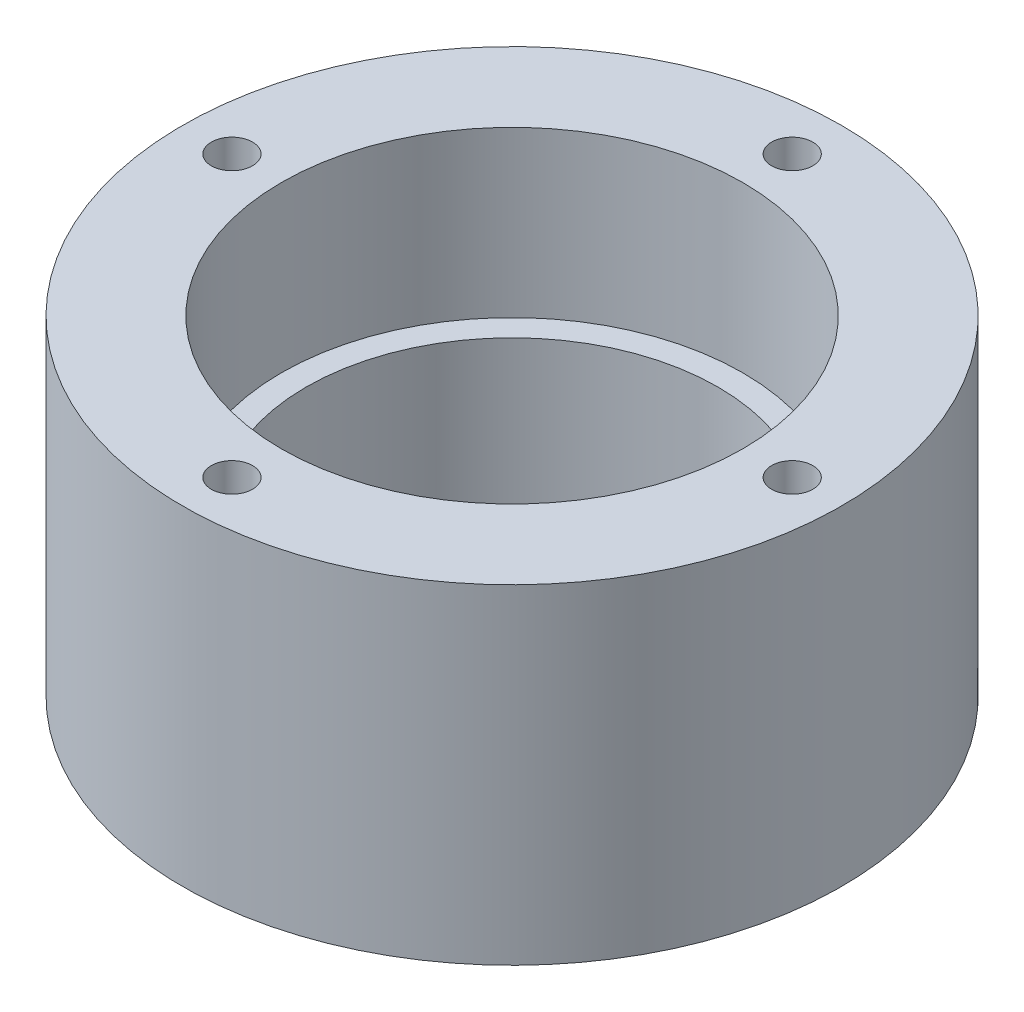
ISO-10303-21;
HEADER;
FILE_DESCRIPTION(('STEP AP214'),'2;1');
FILE_NAME('part.step','',(''),(''),'','','');
FILE_SCHEMA(('AUTOMOTIVE_DESIGN { 1 0 10303 214 1 1 1 1 }'));
ENDSEC;
DATA;
#1=APPLICATION_CONTEXT('core data for automotive mechanical design processes');
#2=APPLICATION_PROTOCOL_DEFINITION('international standard','automotive_design',2000,#1);
#3=PRODUCT_CONTEXT('',#1,'mechanical');
#4=PRODUCT('Part','Part','',(#3));
#5=PRODUCT_RELATED_PRODUCT_CATEGORY('part','',(#4));
#6=PRODUCT_DEFINITION_FORMATION('','',#4);
#7=PRODUCT_DEFINITION_CONTEXT('part definition',#1,'design');
#8=PRODUCT_DEFINITION('design','',#6,#7);
#9=PRODUCT_DEFINITION_SHAPE('','',#8);
#10=(LENGTH_UNIT() NAMED_UNIT(*) SI_UNIT(.MILLI.,.METRE.));
#11=(NAMED_UNIT(*) PLANE_ANGLE_UNIT() SI_UNIT($,.RADIAN.));
#12=(NAMED_UNIT(*) SI_UNIT($,.STERADIAN.) SOLID_ANGLE_UNIT());
#13=UNCERTAINTY_MEASURE_WITH_UNIT(LENGTH_MEASURE(1.E-05),#10,'distance_accuracy_value','');
#14=(GEOMETRIC_REPRESENTATION_CONTEXT(3) GLOBAL_UNCERTAINTY_ASSIGNED_CONTEXT((#13)) GLOBAL_UNIT_ASSIGNED_CONTEXT((#10,
#11,#12)) REPRESENTATION_CONTEXT('',''));
#15=CARTESIAN_POINT('',(0.,0.,0.));
#16=DIRECTION('',(0.,0.,1.));
#17=DIRECTION('',(1.,0.,0.));
#18=AXIS2_PLACEMENT_3D('',#15,#16,#17);
#19=CARTESIAN_POINT('',(0.,-15.5291382958894,0.));
#20=DIRECTION('',(0.,-1.,0.));
#21=DIRECTION('',(0.,0.,-1.));
#22=AXIS2_PLACEMENT_3D('',#19,#20,#21);
#23=CYLINDRICAL_SURFACE('',#22,12.5);
#24=CARTESIAN_POINT('',(0.,10.,0.));
#25=DIRECTION('',(0.,-1.,0.));
#26=DIRECTION('',(0.,0.,-1.));
#27=AXIS2_PLACEMENT_3D('',#24,#25,#26);
#28=CIRCLE('',#27,12.5);
#29=CARTESIAN_POINT('',(0.,10.,-12.5));
#30=VERTEX_POINT('',#29);
#31=EDGE_CURVE('E102',#30,#30,#28,.T.);
#32=ORIENTED_EDGE('',*,*,#31,.F.);
#33=EDGE_LOOP('',(#32));
#34=FACE_BOUND('',#33,.T.);
#35=CARTESIAN_POINT('',(0.,0.,0.));
#36=DIRECTION('',(0.,-1.,0.));
#37=DIRECTION('',(0.,0.,-1.));
#38=AXIS2_PLACEMENT_3D('',#35,#36,#37);
#39=CIRCLE('',#38,12.5);
#40=CARTESIAN_POINT('',(0.,0.,-12.5));
#41=VERTEX_POINT('',#40);
#42=EDGE_CURVE('E105',#41,#41,#39,.T.);
#43=ORIENTED_EDGE('',*,*,#42,.T.);
#44=EDGE_LOOP('',(#43));
#45=FACE_BOUND('',#44,.T.);
#46=ADVANCED_FACE('F43',(#34,#45),#23,.F.);
#47=CARTESIAN_POINT('',(12.5,20.,0.));
#48=DIRECTION('',(0.,1.,0.));
#49=DIRECTION('',(0.,0.,1.));
#50=AXIS2_PLACEMENT_3D('',#47,#48,#49);
#51=PLANE('',#50);
#52=CARTESIAN_POINT('',(-17.,20.,0.));
#53=DIRECTION('',(0.,1.,0.));
#54=DIRECTION('',(0.,0.,1.));
#55=AXIS2_PLACEMENT_3D('',#52,#53,#54);
#56=CIRCLE('',#55,1.25);
#57=CARTESIAN_POINT('',(-17.,20.,1.25));
#58=VERTEX_POINT('',#57);
#59=EDGE_CURVE('E74',#58,#58,#56,.T.);
#60=ORIENTED_EDGE('',*,*,#59,.F.);
#61=EDGE_LOOP('',(#60));
#62=FACE_BOUND('',#61,.T.);
#63=CARTESIAN_POINT('',(17.,20.,0.));
#64=DIRECTION('',(0.,1.,0.));
#65=DIRECTION('',(0.,0.,1.));
#66=AXIS2_PLACEMENT_3D('',#63,#64,#65);
#67=CIRCLE('',#66,1.25);
#68=CARTESIAN_POINT('',(17.,20.,1.25));
#69=VERTEX_POINT('',#68);
#70=EDGE_CURVE('E73',#69,#69,#67,.T.);
#71=ORIENTED_EDGE('',*,*,#70,.F.);
#72=EDGE_LOOP('',(#71));
#73=FACE_BOUND('',#72,.T.);
#74=CARTESIAN_POINT('',(0.,20.,-17.));
#75=DIRECTION('',(0.,1.,0.));
#76=DIRECTION('',(0.,0.,1.));
#77=AXIS2_PLACEMENT_3D('',#74,#75,#76);
#78=CIRCLE('',#77,1.25);
#79=CARTESIAN_POINT('',(0.,20.,-15.75));
#80=VERTEX_POINT('',#79);
#81=EDGE_CURVE('E84',#80,#80,#78,.T.);
#82=ORIENTED_EDGE('',*,*,#81,.F.);
#83=EDGE_LOOP('',(#82));
#84=FACE_BOUND('',#83,.T.);
#85=CARTESIAN_POINT('',(0.,20.,17.));
#86=DIRECTION('',(0.,1.,0.));
#87=DIRECTION('',(0.,0.,1.));
#88=AXIS2_PLACEMENT_3D('',#85,#86,#87);
#89=CIRCLE('',#88,1.25);
#90=CARTESIAN_POINT('',(0.,20.,18.25));
#91=VERTEX_POINT('',#90);
#92=EDGE_CURVE('E90',#91,#91,#89,.T.);
#93=ORIENTED_EDGE('',*,*,#92,.F.);
#94=EDGE_LOOP('',(#93));
#95=FACE_BOUND('',#94,.T.);
#96=CARTESIAN_POINT('',(0.,20.,0.));
#97=DIRECTION('',(0.,-1.,0.));
#98=DIRECTION('',(0.,0.,-1.));
#99=AXIS2_PLACEMENT_3D('',#96,#97,#98);
#100=CIRCLE('',#99,14.);
#101=CARTESIAN_POINT('',(0.,20.,-14.));
#102=VERTEX_POINT('',#101);
#103=EDGE_CURVE('E96',#102,#102,#100,.T.);
#104=ORIENTED_EDGE('',*,*,#103,.T.);
#105=EDGE_LOOP('',(#104));
#106=FACE_BOUND('',#105,.T.);
#107=CARTESIAN_POINT('',(0.,20.,0.));
#108=DIRECTION('',(0.,-1.,0.));
#109=DIRECTION('',(0.,0.,-1.));
#110=AXIS2_PLACEMENT_3D('',#107,#108,#109);
#111=CIRCLE('',#110,20.);
#112=CARTESIAN_POINT('',(0.,20.,-20.));
#113=VERTEX_POINT('',#112);
#114=EDGE_CURVE('E11',#113,#113,#111,.T.);
#115=ORIENTED_EDGE('',*,*,#114,.F.);
#116=EDGE_LOOP('',(#115));
#117=FACE_BOUND('',#116,.T.);
#118=ADVANCED_FACE('F115',(#62,#73,#84,#95,#106,#117),#51,.T.);
#119=CARTESIAN_POINT('',(0.,-15.5291382958894,0.));
#120=DIRECTION('',(0.,-1.,0.));
#121=DIRECTION('',(0.,0.,-1.));
#122=AXIS2_PLACEMENT_3D('',#119,#120,#121);
#123=CYLINDRICAL_SURFACE('',#122,20.);
#124=ORIENTED_EDGE('',*,*,#114,.T.);
#125=EDGE_LOOP('',(#124));
#126=FACE_BOUND('',#125,.T.);
#127=CARTESIAN_POINT('',(0.,0.,0.));
#128=DIRECTION('',(0.,-1.,0.));
#129=DIRECTION('',(0.,0.,-1.));
#130=AXIS2_PLACEMENT_3D('',#127,#128,#129);
#131=CIRCLE('',#130,20.);
#132=CARTESIAN_POINT('',(0.,0.,-20.));
#133=VERTEX_POINT('',#132);
#134=EDGE_CURVE('E50',#133,#133,#131,.T.);
#135=ORIENTED_EDGE('',*,*,#134,.F.);
#136=EDGE_LOOP('',(#135));
#137=FACE_BOUND('',#136,.T.);
#138=ADVANCED_FACE('F113',(#126,#137),#123,.T.);
#139=CARTESIAN_POINT('',(12.5,0.,0.));
#140=DIRECTION('',(0.,-1.,0.));
#141=DIRECTION('',(0.,0.,-1.));
#142=AXIS2_PLACEMENT_3D('',#139,#140,#141);
#143=PLANE('',#142);
#144=ORIENTED_EDGE('',*,*,#134,.T.);
#145=EDGE_LOOP('',(#144));
#146=FACE_BOUND('',#145,.T.);
#147=ORIENTED_EDGE('',*,*,#42,.F.);
#148=EDGE_LOOP('',(#147));
#149=FACE_BOUND('',#148,.T.);
#150=ADVANCED_FACE('F110',(#146,#149),#143,.T.);
#151=CARTESIAN_POINT('',(12.5,10.,0.));
#152=DIRECTION('',(0.,-1.,0.));
#153=DIRECTION('',(0.,0.,-1.));
#154=AXIS2_PLACEMENT_3D('',#151,#152,#153);
#155=PLANE('',#154);
#156=CARTESIAN_POINT('',(0.,10.,0.));
#157=DIRECTION('',(0.,-1.,0.));
#158=DIRECTION('',(0.,0.,-1.));
#159=AXIS2_PLACEMENT_3D('',#156,#157,#158);
#160=CIRCLE('',#159,14.);
#161=CARTESIAN_POINT('',(0.,10.,-14.));
#162=VERTEX_POINT('',#161);
#163=EDGE_CURVE('E99',#162,#162,#160,.T.);
#164=ORIENTED_EDGE('',*,*,#163,.F.);
#165=EDGE_LOOP('',(#164));
#166=FACE_BOUND('',#165,.T.);
#167=ORIENTED_EDGE('',*,*,#31,.T.);
#168=EDGE_LOOP('',(#167));
#169=FACE_BOUND('',#168,.T.);
#170=ADVANCED_FACE('F121',(#166,#169),#155,.F.);
#171=CARTESIAN_POINT('',(0.,-1.54785098295728,0.));
#172=DIRECTION('',(0.,-1.,0.));
#173=DIRECTION('',(0.,0.,-1.));
#174=AXIS2_PLACEMENT_3D('',#171,#172,#173);
#175=CYLINDRICAL_SURFACE('',#174,14.);
#176=ORIENTED_EDGE('',*,*,#103,.F.);
#177=EDGE_LOOP('',(#176));
#178=FACE_BOUND('',#177,.T.);
#179=ORIENTED_EDGE('',*,*,#163,.T.);
#180=EDGE_LOOP('',(#179));
#181=FACE_BOUND('',#180,.T.);
#182=ADVANCED_FACE('F134',(#178,#181),#175,.F.);
#183=CARTESIAN_POINT('',(0.,11.5,17.));
#184=DIRECTION('',(0.,1.,0.));
#185=DIRECTION('',(0.,0.,1.));
#186=AXIS2_PLACEMENT_3D('',#183,#184,#185);
#187=CONICAL_SURFACE('',#186,1.25,1.02974425867665);
#188=CARTESIAN_POINT('',(0.,10.7489242262155,17.));
#189=VERTEX_POINT('',#188);
#190=VERTEX_LOOP('',#189);
#191=FACE_BOUND('',#190,.T.);
#192=CARTESIAN_POINT('',(0.,11.5,17.));
#193=DIRECTION('',(0.,1.,0.));
#194=DIRECTION('',(0.,0.,1.));
#195=AXIS2_PLACEMENT_3D('',#192,#193,#194);
#196=CIRCLE('',#195,1.25);
#197=CARTESIAN_POINT('',(0.,11.5,18.25));
#198=VERTEX_POINT('',#197);
#199=EDGE_CURVE('E93',#198,#198,#196,.T.);
#200=ORIENTED_EDGE('',*,*,#199,.T.);
#201=EDGE_LOOP('',(#200));
#202=FACE_BOUND('',#201,.T.);
#203=ADVANCED_FACE('F140',(#191,#202),#187,.F.);
#204=CARTESIAN_POINT('',(0.,20.,17.));
#205=DIRECTION('',(0.,1.,0.));
#206=DIRECTION('',(0.,0.,1.));
#207=AXIS2_PLACEMENT_3D('',#204,#205,#206);
#208=CYLINDRICAL_SURFACE('',#207,1.25);
#209=ORIENTED_EDGE('',*,*,#199,.F.);
#210=EDGE_LOOP('',(#209));
#211=FACE_BOUND('',#210,.T.);
#212=ORIENTED_EDGE('',*,*,#92,.T.);
#213=EDGE_LOOP('',(#212));
#214=FACE_BOUND('',#213,.T.);
#215=ADVANCED_FACE('F147',(#211,#214),#208,.F.);
#216=CARTESIAN_POINT('',(0.,11.5,-17.));
#217=DIRECTION('',(0.,1.,0.));
#218=DIRECTION('',(0.,0.,1.));
#219=AXIS2_PLACEMENT_3D('',#216,#217,#218);
#220=CONICAL_SURFACE('',#219,1.25,1.02974425867665);
#221=CARTESIAN_POINT('',(0.,10.7489242262155,-17.));
#222=VERTEX_POINT('',#221);
#223=VERTEX_LOOP('',#222);
#224=FACE_BOUND('',#223,.T.);
#225=CARTESIAN_POINT('',(0.,11.5,-17.));
#226=DIRECTION('',(0.,1.,0.));
#227=DIRECTION('',(0.,0.,1.));
#228=AXIS2_PLACEMENT_3D('',#225,#226,#227);
#229=CIRCLE('',#228,1.25);
#230=CARTESIAN_POINT('',(0.,11.5,-15.75));
#231=VERTEX_POINT('',#230);
#232=EDGE_CURVE('E87',#231,#231,#229,.T.);
#233=ORIENTED_EDGE('',*,*,#232,.T.);
#234=EDGE_LOOP('',(#233));
#235=FACE_BOUND('',#234,.T.);
#236=ADVANCED_FACE('F150',(#224,#235),#220,.F.);
#237=CARTESIAN_POINT('',(0.,20.,-17.));
#238=DIRECTION('',(0.,1.,0.));
#239=DIRECTION('',(0.,0.,1.));
#240=AXIS2_PLACEMENT_3D('',#237,#238,#239);
#241=CYLINDRICAL_SURFACE('',#240,1.25);
#242=ORIENTED_EDGE('',*,*,#232,.F.);
#243=EDGE_LOOP('',(#242));
#244=FACE_BOUND('',#243,.T.);
#245=ORIENTED_EDGE('',*,*,#81,.T.);
#246=EDGE_LOOP('',(#245));
#247=FACE_BOUND('',#246,.T.);
#248=ADVANCED_FACE('F154',(#244,#247),#241,.F.);
#249=CARTESIAN_POINT('',(17.,11.5,0.));
#250=DIRECTION('',(0.,1.,0.));
#251=DIRECTION('',(0.,0.,1.));
#252=AXIS2_PLACEMENT_3D('',#249,#250,#251);
#253=CONICAL_SURFACE('',#252,1.25,1.02974425867665);
#254=CARTESIAN_POINT('',(17.,10.7489242262155,0.));
#255=VERTEX_POINT('',#254);
#256=VERTEX_LOOP('',#255);
#257=FACE_BOUND('',#256,.T.);
#258=CARTESIAN_POINT('',(17.,11.5,0.));
#259=DIRECTION('',(0.,1.,0.));
#260=DIRECTION('',(0.,0.,1.));
#261=AXIS2_PLACEMENT_3D('',#258,#259,#260);
#262=CIRCLE('',#261,1.25);
#263=CARTESIAN_POINT('',(17.,11.5,1.25));
#264=VERTEX_POINT('',#263);
#265=EDGE_CURVE('E77',#264,#264,#262,.T.);
#266=ORIENTED_EDGE('',*,*,#265,.T.);
#267=EDGE_LOOP('',(#266));
#268=FACE_BOUND('',#267,.T.);
#269=ADVANCED_FACE('F157',(#257,#268),#253,.F.);
#270=CARTESIAN_POINT('',(17.,20.,0.));
#271=DIRECTION('',(0.,1.,0.));
#272=DIRECTION('',(0.,0.,1.));
#273=AXIS2_PLACEMENT_3D('',#270,#271,#272);
#274=CYLINDRICAL_SURFACE('',#273,1.25);
#275=ORIENTED_EDGE('',*,*,#265,.F.);
#276=EDGE_LOOP('',(#275));
#277=FACE_BOUND('',#276,.T.);
#278=ORIENTED_EDGE('',*,*,#70,.T.);
#279=EDGE_LOOP('',(#278));
#280=FACE_BOUND('',#279,.T.);
#281=ADVANCED_FACE('F67',(#277,#280),#274,.F.);
#282=CARTESIAN_POINT('',(-17.,11.5,0.));
#283=DIRECTION('',(0.,1.,0.));
#284=DIRECTION('',(0.,0.,1.));
#285=AXIS2_PLACEMENT_3D('',#282,#283,#284);
#286=CONICAL_SURFACE('',#285,1.25,1.02974425867665);
#287=CARTESIAN_POINT('',(-17.,10.7489242262155,0.));
#288=VERTEX_POINT('',#287);
#289=VERTEX_LOOP('',#288);
#290=FACE_BOUND('',#289,.T.);
#291=CARTESIAN_POINT('',(-17.,11.5,0.));
#292=DIRECTION('',(0.,1.,0.));
#293=DIRECTION('',(0.,0.,1.));
#294=AXIS2_PLACEMENT_3D('',#291,#292,#293);
#295=CIRCLE('',#294,1.25);
#296=CARTESIAN_POINT('',(-17.,11.5,1.25));
#297=VERTEX_POINT('',#296);
#298=EDGE_CURVE('E71',#297,#297,#295,.T.);
#299=ORIENTED_EDGE('',*,*,#298,.T.);
#300=EDGE_LOOP('',(#299));
#301=FACE_BOUND('',#300,.T.);
#302=ADVANCED_FACE('F63',(#290,#301),#286,.F.);
#303=CARTESIAN_POINT('',(-17.,20.,0.));
#304=DIRECTION('',(0.,1.,0.));
#305=DIRECTION('',(0.,0.,1.));
#306=AXIS2_PLACEMENT_3D('',#303,#304,#305);
#307=CYLINDRICAL_SURFACE('',#306,1.25);
#308=ORIENTED_EDGE('',*,*,#298,.F.);
#309=EDGE_LOOP('',(#308));
#310=FACE_BOUND('',#309,.T.);
#311=ORIENTED_EDGE('',*,*,#59,.T.);
#312=EDGE_LOOP('',(#311));
#313=FACE_BOUND('',#312,.T.);
#314=ADVANCED_FACE('F66',(#310,#313),#307,.F.);
#315=CLOSED_SHELL('',(#46,#118,#138,#150,#170,#182,#203,#215,#236,#248,#269,#281,#302,#314));
#316=MANIFOLD_SOLID_BREP('B2',#315);
#317=ADVANCED_BREP_SHAPE_REPRESENTATION('',(#18,#316),#14);
#318=SHAPE_DEFINITION_REPRESENTATION(#9,#317);
ENDSEC;
END-ISO-10303-21;
